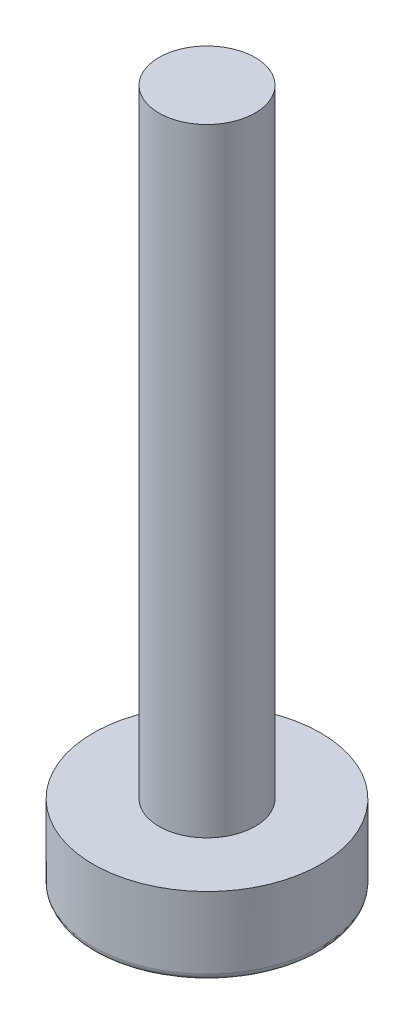
ISO-10303-21;
HEADER;
FILE_DESCRIPTION(('STEP AP214'),'2;1');
FILE_NAME('part.step','',(''),(''),'','','');
FILE_SCHEMA(('AUTOMOTIVE_DESIGN { 1 0 10303 214 1 1 1 1 }'));
ENDSEC;
DATA;
#1=APPLICATION_CONTEXT('core data for automotive mechanical design processes');
#2=APPLICATION_PROTOCOL_DEFINITION('international standard','automotive_design',2000,#1);
#3=PRODUCT_CONTEXT('',#1,'mechanical');
#4=PRODUCT('Part','Part','',(#3));
#5=PRODUCT_RELATED_PRODUCT_CATEGORY('part','',(#4));
#6=PRODUCT_DEFINITION_FORMATION('','',#4);
#7=PRODUCT_DEFINITION_CONTEXT('part definition',#1,'design');
#8=PRODUCT_DEFINITION('design','',#6,#7);
#9=PRODUCT_DEFINITION_SHAPE('','',#8);
#10=(LENGTH_UNIT() NAMED_UNIT(*) SI_UNIT(.MILLI.,.METRE.));
#11=(NAMED_UNIT(*) PLANE_ANGLE_UNIT() SI_UNIT($,.RADIAN.));
#12=(NAMED_UNIT(*) SI_UNIT($,.STERADIAN.) SOLID_ANGLE_UNIT());
#13=UNCERTAINTY_MEASURE_WITH_UNIT(LENGTH_MEASURE(1.E-05),#10,'distance_accuracy_value','');
#14=(GEOMETRIC_REPRESENTATION_CONTEXT(3) GLOBAL_UNCERTAINTY_ASSIGNED_CONTEXT((#13)) GLOBAL_UNIT_ASSIGNED_CONTEXT((#10,
#11,#12)) REPRESENTATION_CONTEXT('',''));
#15=CARTESIAN_POINT('',(0.,0.,0.));
#16=DIRECTION('',(0.,0.,1.));
#17=DIRECTION('',(1.,0.,0.));
#18=AXIS2_PLACEMENT_3D('',#15,#16,#17);
#19=CARTESIAN_POINT('',(0.,3.048,0.));
#20=DIRECTION('',(0.,-1.,0.));
#21=DIRECTION('',(0.,0.,-1.));
#22=AXIS2_PLACEMENT_3D('',#19,#20,#21);
#23=CYLINDRICAL_SURFACE('',#22,4.445);
#24=CARTESIAN_POINT('',(0.,0.254,0.));
#25=DIRECTION('',(0.,1.,0.));
#26=DIRECTION('',(0.,0.,1.));
#27=AXIS2_PLACEMENT_3D('',#24,#25,#26);
#28=CIRCLE('',#27,4.445);
#29=CARTESIAN_POINT('',(0.,0.254,-4.445));
#30=VERTEX_POINT('',#29);
#31=EDGE_CURVE('E37',#30,#30,#28,.T.);
#32=CARTESIAN_POINT('',(0.,3.048,0.));
#33=DIRECTION('',(0.,1.,0.));
#34=DIRECTION('',(0.,0.,1.));
#35=AXIS2_PLACEMENT_3D('',#32,#33,#34);
#36=CIRCLE('',#35,4.445);
#37=CARTESIAN_POINT('',(0.,3.048,-4.445));
#38=VERTEX_POINT('',#37);
#39=EDGE_CURVE('E41',#38,#38,#36,.T.);
#40=CARTESIAN_POINT('',(0.,0.254,-4.445));
#41=CARTESIAN_POINT('',(0.,0.283104166666667,-4.445));
#42=CARTESIAN_POINT('',(0.,0.312208333333333,-4.445));
#43=CARTESIAN_POINT('',(0.,0.370416666666667,-4.445));
#44=CARTESIAN_POINT('',(0.,0.399520833333333,-4.445));
#45=CARTESIAN_POINT('',(0.,0.457729166666666,-4.445));
#46=CARTESIAN_POINT('',(0.,0.486833333333333,-4.445));
#47=CARTESIAN_POINT('',(0.,0.545041666666667,-4.445));
#48=CARTESIAN_POINT('',(0.,0.574145833333333,-4.445));
#49=CARTESIAN_POINT('',(0.,0.632354166666667,-4.445));
#50=CARTESIAN_POINT('',(0.,0.661458333333333,-4.445));
#51=CARTESIAN_POINT('',(0.,0.719666666666667,-4.445));
#52=CARTESIAN_POINT('',(0.,0.748770833333333,-4.445));
#53=CARTESIAN_POINT('',(0.,0.806979166666666,-4.445));
#54=CARTESIAN_POINT('',(0.,0.836083333333333,-4.445));
#55=CARTESIAN_POINT('',(0.,0.894291666666666,-4.445));
#56=CARTESIAN_POINT('',(0.,0.923395833333333,-4.445));
#57=CARTESIAN_POINT('',(0.,0.981604166666666,-4.445));
#58=CARTESIAN_POINT('',(0.,1.01070833333333,-4.445));
#59=CARTESIAN_POINT('',(0.,1.06891666666667,-4.445));
#60=CARTESIAN_POINT('',(0.,1.09802083333333,-4.445));
#61=CARTESIAN_POINT('',(0.,1.15622916666667,-4.445));
#62=CARTESIAN_POINT('',(0.,1.18533333333333,-4.445));
#63=CARTESIAN_POINT('',(0.,1.24354166666667,-4.445));
#64=CARTESIAN_POINT('',(0.,1.27264583333333,-4.445));
#65=CARTESIAN_POINT('',(0.,1.33085416666667,-4.445));
#66=CARTESIAN_POINT('',(0.,1.35995833333333,-4.445));
#67=CARTESIAN_POINT('',(0.,1.41816666666667,-4.445));
#68=CARTESIAN_POINT('',(0.,1.44727083333333,-4.445));
#69=CARTESIAN_POINT('',(0.,1.50547916666667,-4.445));
#70=CARTESIAN_POINT('',(0.,1.53458333333333,-4.445));
#71=CARTESIAN_POINT('',(0.,1.59279166666667,-4.445));
#72=CARTESIAN_POINT('',(0.,1.62189583333333,-4.445));
#73=CARTESIAN_POINT('',(0.,1.68010416666667,-4.445));
#74=CARTESIAN_POINT('',(0.,1.70920833333333,-4.445));
#75=CARTESIAN_POINT('',(0.,1.76741666666667,-4.445));
#76=CARTESIAN_POINT('',(0.,1.79652083333333,-4.445));
#77=CARTESIAN_POINT('',(0.,1.85472916666667,-4.445));
#78=CARTESIAN_POINT('',(0.,1.88383333333333,-4.445));
#79=CARTESIAN_POINT('',(0.,1.94204166666667,-4.445));
#80=CARTESIAN_POINT('',(0.,1.97114583333333,-4.445));
#81=CARTESIAN_POINT('',(0.,2.02935416666667,-4.445));
#82=CARTESIAN_POINT('',(0.,2.05845833333333,-4.445));
#83=CARTESIAN_POINT('',(0.,2.11666666666667,-4.445));
#84=CARTESIAN_POINT('',(0.,2.14577083333333,-4.445));
#85=CARTESIAN_POINT('',(0.,2.20397916666667,-4.445));
#86=CARTESIAN_POINT('',(0.,2.23308333333333,-4.445));
#87=CARTESIAN_POINT('',(0.,2.29129166666667,-4.445));
#88=CARTESIAN_POINT('',(0.,2.32039583333333,-4.445));
#89=CARTESIAN_POINT('',(0.,2.37860416666667,-4.445));
#90=CARTESIAN_POINT('',(0.,2.40770833333333,-4.445));
#91=CARTESIAN_POINT('',(0.,2.46591666666667,-4.445));
#92=CARTESIAN_POINT('',(0.,2.49502083333333,-4.445));
#93=CARTESIAN_POINT('',(0.,2.55322916666667,-4.445));
#94=CARTESIAN_POINT('',(0.,2.58233333333333,-4.445));
#95=CARTESIAN_POINT('',(0.,2.64054166666667,-4.445));
#96=CARTESIAN_POINT('',(0.,2.66964583333333,-4.445));
#97=CARTESIAN_POINT('',(0.,2.72785416666667,-4.445));
#98=CARTESIAN_POINT('',(0.,2.75695833333333,-4.445));
#99=CARTESIAN_POINT('',(0.,2.81516666666667,-4.445));
#100=CARTESIAN_POINT('',(0.,2.84427083333333,-4.445));
#101=CARTESIAN_POINT('',(0.,2.90247916666667,-4.445));
#102=CARTESIAN_POINT('',(0.,2.93158333333333,-4.445));
#103=CARTESIAN_POINT('',(0.,2.98979166666667,-4.445));
#104=CARTESIAN_POINT('',(0.,3.01889583333333,-4.445));
#105=CARTESIAN_POINT('',(0.,3.048,-4.445));
#106=B_SPLINE_CURVE_WITH_KNOTS('',3,(#40,#41,#42,#43,#44,#45,#46,#47,#48,#49,#50,#51,#52,#53,
#54,#55,#56,#57,#58,#59,#60,#61,#62,#63,#64,#65,#66,#67,#68,#69,#70,#71,#72,#73,#74,#75,#76,#77,
#78,#79,#80,#81,#82,#83,#84,#85,#86,#87,#88,#89,#90,#91,#92,#93,#94,#95,#96,#97,#98,#99,#100,
#101,#102,#103,#104,#105),.UNSPECIFIED.,.F.,.F.,(4,2,2,2,2,2,2,2,2,2,2,2,2,2,2,2,2,2,2,2,2,2,2,
2,2,2,2,2,2,2,2,2,4),(0.,0.0873125000000002,0.174625,0.2619375,0.34925,0.4365625,0.523875,
0.6111875,0.6985,0.7858125,0.873125,0.9604375,1.04775,1.1350625,1.222375,1.3096875,1.397,
1.4843125,1.571625,1.6589375,1.74625,1.8335625,1.920875,2.0081875,2.0955,2.1828125,2.270125,
2.3574375,2.44475,2.5320625,2.619375,2.7066875,2.794),.UNSPECIFIED.);
#107=EDGE_CURVE('BSEAM30',#30,#38,#106,.T.);
#108=ORIENTED_EDGE('',*,*,#31,.T.);
#109=ORIENTED_EDGE('',*,*,#39,.F.);
#110=ORIENTED_EDGE('',*,*,#107,.T.);
#111=ORIENTED_EDGE('',*,*,#107,.F.);
#112=EDGE_LOOP('',(#108,#110,#109,#111));
#113=FACE_BOUND('',#112,.T.);
#114=ADVANCED_FACE('F30',(#113),#23,.T.);
#115=CARTESIAN_POINT('',(0.,3.048,0.));
#116=DIRECTION('',(0.,1.,0.));
#117=DIRECTION('',(0.,0.,1.));
#118=AXIS2_PLACEMENT_3D('',#115,#116,#117);
#119=PLANE('',#118);
#120=CARTESIAN_POINT('',(0.,3.048,0.));
#121=DIRECTION('',(0.,1.,0.));
#122=DIRECTION('',(0.,0.,1.));
#123=AXIS2_PLACEMENT_3D('',#120,#121,#122);
#124=CIRCLE('',#123,1.8796);
#125=CARTESIAN_POINT('',(0.,3.048,-1.8796));
#126=VERTEX_POINT('',#125);
#127=EDGE_CURVE('E48',#126,#126,#124,.T.);
#128=ORIENTED_EDGE('',*,*,#127,.F.);
#129=EDGE_LOOP('',(#128));
#130=FACE_BOUND('',#129,.T.);
#131=ORIENTED_EDGE('',*,*,#39,.T.);
#132=EDGE_LOOP('',(#131));
#133=FACE_BOUND('',#132,.T.);
#134=ADVANCED_FACE('F63',(#130,#133),#119,.T.);
#135=CARTESIAN_POINT('',(0.,0.,0.));
#136=DIRECTION('',(0.,1.,0.));
#137=DIRECTION('',(0.,0.,1.));
#138=AXIS2_PLACEMENT_3D('',#135,#136,#137);
#139=PLANE('',#138);
#140=CARTESIAN_POINT('',(0.,0.,0.));
#141=DIRECTION('',(0.,1.,0.));
#142=DIRECTION('',(0.,0.,1.));
#143=AXIS2_PLACEMENT_3D('',#140,#141,#142);
#144=CIRCLE('',#143,4.191);
#145=CARTESIAN_POINT('',(0.,0.,4.191));
#146=VERTEX_POINT('',#145);
#147=EDGE_CURVE('E10',#146,#146,#144,.F.);
#148=ORIENTED_EDGE('',*,*,#147,.T.);
#149=EDGE_LOOP('',(#148));
#150=FACE_BOUND('',#149,.T.);
#151=ADVANCED_FACE('F59',(#150),#139,.F.);
#152=CARTESIAN_POINT('',(0.,27.178,0.));
#153=DIRECTION('',(0.,-1.,0.));
#154=DIRECTION('',(0.,0.,-1.));
#155=AXIS2_PLACEMENT_3D('',#152,#153,#154);
#156=CYLINDRICAL_SURFACE('',#155,1.8796);
#157=CARTESIAN_POINT('',(0.,27.178,0.));
#158=DIRECTION('',(0.,1.,0.));
#159=DIRECTION('',(0.,0.,1.));
#160=AXIS2_PLACEMENT_3D('',#157,#158,#159);
#161=CIRCLE('',#160,1.8796);
#162=CARTESIAN_POINT('',(0.,27.178,-1.8796));
#163=VERTEX_POINT('',#162);
#164=EDGE_CURVE('E45',#163,#163,#161,.T.);
#165=CARTESIAN_POINT('',(0.,27.178,-1.8796));
#166=CARTESIAN_POINT('',(0.,26.9266458333333,-1.8796));
#167=CARTESIAN_POINT('',(0.,26.6752916666667,-1.8796));
#168=CARTESIAN_POINT('',(0.,26.1725833333333,-1.8796));
#169=CARTESIAN_POINT('',(0.,25.9212291666667,-1.8796));
#170=CARTESIAN_POINT('',(0.,25.4185208333333,-1.8796));
#171=CARTESIAN_POINT('',(0.,25.1671666666667,-1.8796));
#172=CARTESIAN_POINT('',(0.,24.6644583333333,-1.8796));
#173=CARTESIAN_POINT('',(0.,24.4131041666667,-1.8796));
#174=CARTESIAN_POINT('',(0.,23.9103958333333,-1.8796));
#175=CARTESIAN_POINT('',(0.,23.6590416666667,-1.8796));
#176=CARTESIAN_POINT('',(0.,23.1563333333333,-1.8796));
#177=CARTESIAN_POINT('',(0.,22.9049791666667,-1.8796));
#178=CARTESIAN_POINT('',(0.,22.4022708333333,-1.8796));
#179=CARTESIAN_POINT('',(0.,22.1509166666667,-1.8796));
#180=CARTESIAN_POINT('',(0.,21.6482083333333,-1.8796));
#181=CARTESIAN_POINT('',(0.,21.3968541666667,-1.8796));
#182=CARTESIAN_POINT('',(0.,20.8941458333333,-1.8796));
#183=CARTESIAN_POINT('',(0.,20.6427916666667,-1.8796));
#184=CARTESIAN_POINT('',(0.,20.1400833333333,-1.8796));
#185=CARTESIAN_POINT('',(0.,19.8887291666667,-1.8796));
#186=CARTESIAN_POINT('',(0.,19.3860208333333,-1.8796));
#187=CARTESIAN_POINT('',(0.,19.1346666666667,-1.8796));
#188=CARTESIAN_POINT('',(0.,18.6319583333333,-1.8796));
#189=CARTESIAN_POINT('',(0.,18.3806041666667,-1.8796));
#190=CARTESIAN_POINT('',(0.,17.8778958333333,-1.8796));
#191=CARTESIAN_POINT('',(0.,17.6265416666667,-1.8796));
#192=CARTESIAN_POINT('',(0.,17.1238333333333,-1.8796));
#193=CARTESIAN_POINT('',(0.,16.8724791666667,-1.8796));
#194=CARTESIAN_POINT('',(0.,16.3697708333333,-1.8796));
#195=CARTESIAN_POINT('',(0.,16.1184166666667,-1.8796));
#196=CARTESIAN_POINT('',(0.,15.6157083333333,-1.8796));
#197=CARTESIAN_POINT('',(0.,15.3643541666667,-1.8796));
#198=CARTESIAN_POINT('',(0.,14.8616458333333,-1.8796));
#199=CARTESIAN_POINT('',(0.,14.6102916666667,-1.8796));
#200=CARTESIAN_POINT('',(0.,14.1075833333333,-1.8796));
#201=CARTESIAN_POINT('',(0.,13.8562291666667,-1.8796));
#202=CARTESIAN_POINT('',(0.,13.3535208333333,-1.8796));
#203=CARTESIAN_POINT('',(0.,13.1021666666667,-1.8796));
#204=CARTESIAN_POINT('',(0.,12.5994583333333,-1.8796));
#205=CARTESIAN_POINT('',(0.,12.3481041666667,-1.8796));
#206=CARTESIAN_POINT('',(0.,11.8453958333333,-1.8796));
#207=CARTESIAN_POINT('',(0.,11.5940416666667,-1.8796));
#208=CARTESIAN_POINT('',(0.,11.0913333333333,-1.8796));
#209=CARTESIAN_POINT('',(0.,10.8399791666667,-1.8796));
#210=CARTESIAN_POINT('',(0.,10.3372708333333,-1.8796));
#211=CARTESIAN_POINT('',(0.,10.0859166666667,-1.8796));
#212=CARTESIAN_POINT('',(0.,9.58320833333333,-1.8796));
#213=CARTESIAN_POINT('',(0.,9.33185416666667,-1.8796));
#214=CARTESIAN_POINT('',(0.,8.82914583333334,-1.8796));
#215=CARTESIAN_POINT('',(0.,8.57779166666667,-1.8796));
#216=CARTESIAN_POINT('',(0.,8.07508333333334,-1.8796));
#217=CARTESIAN_POINT('',(0.,7.82372916666667,-1.8796));
#218=CARTESIAN_POINT('',(0.,7.32102083333334,-1.8796));
#219=CARTESIAN_POINT('',(0.,7.06966666666667,-1.8796));
#220=CARTESIAN_POINT('',(0.,6.56695833333334,-1.8796));
#221=CARTESIAN_POINT('',(0.,6.31560416666667,-1.8796));
#222=CARTESIAN_POINT('',(0.,5.81289583333333,-1.8796));
#223=CARTESIAN_POINT('',(0.,5.56154166666667,-1.8796));
#224=CARTESIAN_POINT('',(0.,5.05883333333333,-1.8796));
#225=CARTESIAN_POINT('',(0.,4.80747916666667,-1.8796));
#226=CARTESIAN_POINT('',(0.,4.30477083333334,-1.8796));
#227=CARTESIAN_POINT('',(0.,4.05341666666667,-1.8796));
#228=CARTESIAN_POINT('',(0.,3.55070833333333,-1.8796));
#229=CARTESIAN_POINT('',(0.,3.29935416666667,-1.8796));
#230=CARTESIAN_POINT('',(0.,3.048,-1.8796));
#231=B_SPLINE_CURVE_WITH_KNOTS('',3,(#165,#166,#167,#168,#169,#170,#171,#172,#173,#174,#175,
#176,#177,#178,#179,#180,#181,#182,#183,#184,#185,#186,#187,#188,#189,#190,#191,#192,#193,#194,
#195,#196,#197,#198,#199,#200,#201,#202,#203,#204,#205,#206,#207,#208,#209,#210,#211,#212,#213,
#214,#215,#216,#217,#218,#219,#220,#221,#222,#223,#224,#225,#226,#227,#228,#229,#230),
.UNSPECIFIED.,.F.,.F.,(4,2,2,2,2,2,2,2,2,2,2,2,2,2,2,2,2,2,2,2,2,2,2,2,2,2,2,2,2,2,2,2,4),(0.,
0.754062500000003,1.508125,2.2621875,3.01625,3.7703125,4.524375,5.2784375,6.0325,6.7865625,
7.540625,8.2946875,9.04875,9.8028125,10.556875,11.3109375,12.065,12.8190625,13.573125,
14.3271875,15.08125,15.8353125,16.589375,17.3434375,18.0975,18.8515625,19.605625,20.3596875,
21.11375,21.8678125,22.621875,23.3759375,24.13),.UNSPECIFIED.);
#232=EDGE_CURVE('BSEAM56',#163,#126,#231,.T.);
#233=ORIENTED_EDGE('',*,*,#164,.F.);
#234=ORIENTED_EDGE('',*,*,#127,.T.);
#235=ORIENTED_EDGE('',*,*,#232,.T.);
#236=ORIENTED_EDGE('',*,*,#232,.F.);
#237=EDGE_LOOP('',(#233,#235,#234,#236));
#238=FACE_BOUND('',#237,.T.);
#239=ADVANCED_FACE('F56',(#238),#156,.T.);
#240=CARTESIAN_POINT('',(0.,27.178,0.));
#241=DIRECTION('',(0.,1.,0.));
#242=DIRECTION('',(0.,0.,1.));
#243=AXIS2_PLACEMENT_3D('',#240,#241,#242);
#244=PLANE('',#243);
#245=ORIENTED_EDGE('',*,*,#164,.T.);
#246=EDGE_LOOP('',(#245));
#247=FACE_BOUND('',#246,.T.);
#248=ADVANCED_FACE('F54',(#247),#244,.T.);
#249=CARTESIAN_POINT('',(0.,0.254,0.));
#250=DIRECTION('',(0.,1.,0.));
#251=DIRECTION('',(0.,0.,1.));
#252=AXIS2_PLACEMENT_3D('',#249,#250,#251);
#253=TOROIDAL_SURFACE('',#252,4.191,0.254);
#254=ORIENTED_EDGE('',*,*,#147,.F.);
#255=EDGE_LOOP('',(#254));
#256=FACE_BOUND('',#255,.T.);
#257=ORIENTED_EDGE('',*,*,#31,.F.);
#258=EDGE_LOOP('',(#257));
#259=FACE_BOUND('',#258,.T.);
#260=ADVANCED_FACE('F32',(#256,#259),#253,.T.);
#261=CLOSED_SHELL('',(#114,#134,#151,#239,#248,#260));
#262=MANIFOLD_SOLID_BREP('B2',#261);
#263=ADVANCED_BREP_SHAPE_REPRESENTATION('',(#18,#262),#14);
#264=SHAPE_DEFINITION_REPRESENTATION(#9,#263);
ENDSEC;
END-ISO-10303-21;
